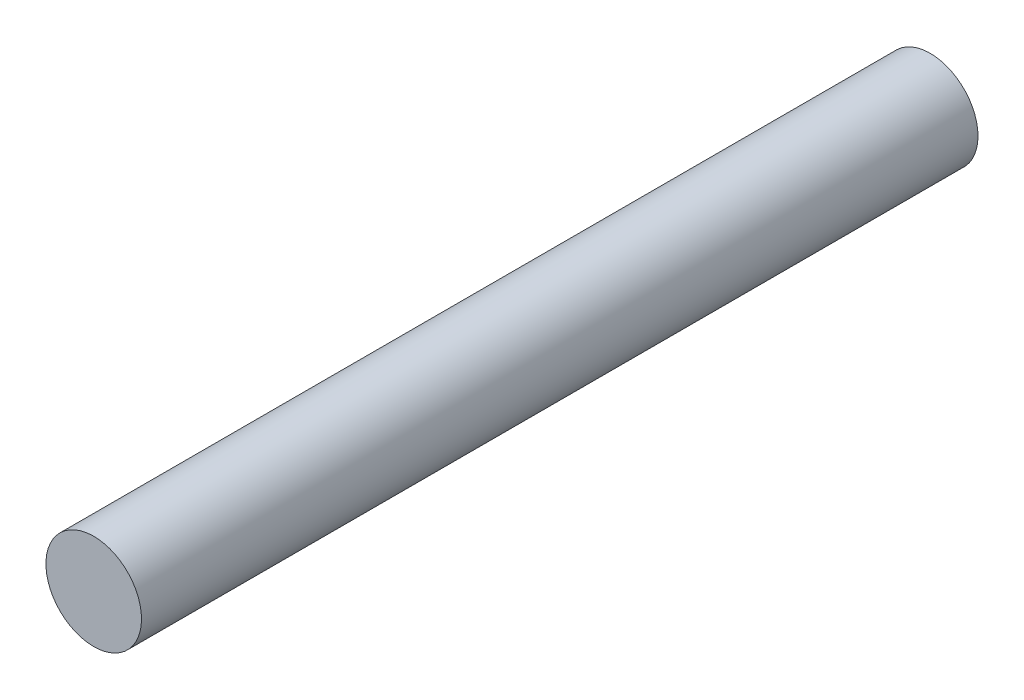
ISO-10303-21;
HEADER;
FILE_DESCRIPTION(('STEP AP214'),'2;1');
FILE_NAME('part.step','',(''),(''),'','','');
FILE_SCHEMA(('AUTOMOTIVE_DESIGN { 1 0 10303 214 1 1 1 1 }'));
ENDSEC;
DATA;
#1=APPLICATION_CONTEXT('core data for automotive mechanical design processes');
#2=APPLICATION_PROTOCOL_DEFINITION('international standard','automotive_design',2000,#1);
#3=PRODUCT_CONTEXT('',#1,'mechanical');
#4=PRODUCT('Part','Part','',(#3));
#5=PRODUCT_RELATED_PRODUCT_CATEGORY('part','',(#4));
#6=PRODUCT_DEFINITION_FORMATION('','',#4);
#7=PRODUCT_DEFINITION_CONTEXT('part definition',#1,'design');
#8=PRODUCT_DEFINITION('design','',#6,#7);
#9=PRODUCT_DEFINITION_SHAPE('','',#8);
#10=(LENGTH_UNIT() NAMED_UNIT(*) SI_UNIT(.MILLI.,.METRE.));
#11=(NAMED_UNIT(*) PLANE_ANGLE_UNIT() SI_UNIT($,.RADIAN.));
#12=(NAMED_UNIT(*) SI_UNIT($,.STERADIAN.) SOLID_ANGLE_UNIT());
#13=UNCERTAINTY_MEASURE_WITH_UNIT(LENGTH_MEASURE(1.E-05),#10,'distance_accuracy_value','');
#14=(GEOMETRIC_REPRESENTATION_CONTEXT(3) GLOBAL_UNCERTAINTY_ASSIGNED_CONTEXT((#13)) GLOBAL_UNIT_ASSIGNED_CONTEXT((#10,
#11,#12)) REPRESENTATION_CONTEXT('',''));
#15=CARTESIAN_POINT('',(0.,0.,0.));
#16=DIRECTION('',(0.,0.,1.));
#17=DIRECTION('',(1.,0.,0.));
#18=AXIS2_PLACEMENT_3D('',#15,#16,#17);
#19=CARTESIAN_POINT('',(0.,0.,70.));
#20=DIRECTION('',(0.,0.,-1.));
#21=DIRECTION('',(-1.,0.,0.));
#22=AXIS2_PLACEMENT_3D('',#19,#20,#21);
#23=CYLINDRICAL_SURFACE('',#22,4.);
#24=CARTESIAN_POINT('',(0.,0.,70.));
#25=DIRECTION('',(0.,0.,1.));
#26=DIRECTION('',(1.,0.,0.));
#27=AXIS2_PLACEMENT_3D('',#24,#25,#26);
#28=CIRCLE('',#27,4.);
#29=CARTESIAN_POINT('',(4.,0.,70.));
#30=VERTEX_POINT('',#29);
#31=EDGE_CURVE('E10',#30,#30,#28,.T.);
#32=ORIENTED_EDGE('',*,*,#31,.F.);
#33=EDGE_LOOP('',(#32));
#34=FACE_BOUND('',#33,.T.);
#35=CARTESIAN_POINT('',(0.,0.,0.));
#36=DIRECTION('',(0.,0.,1.));
#37=DIRECTION('',(1.,0.,0.));
#38=AXIS2_PLACEMENT_3D('',#35,#36,#37);
#39=CIRCLE('',#38,4.);
#40=CARTESIAN_POINT('',(4.,0.,0.));
#41=VERTEX_POINT('',#40);
#42=EDGE_CURVE('E35',#41,#41,#39,.T.);
#43=ORIENTED_EDGE('',*,*,#42,.T.);
#44=EDGE_LOOP('',(#43));
#45=FACE_BOUND('',#44,.T.);
#46=ADVANCED_FACE('F32',(#34,#45),#23,.T.);
#47=CARTESIAN_POINT('',(0.,0.,70.));
#48=DIRECTION('',(0.,0.,1.));
#49=DIRECTION('',(1.,0.,0.));
#50=AXIS2_PLACEMENT_3D('',#47,#48,#49);
#51=PLANE('',#50);
#52=ORIENTED_EDGE('',*,*,#31,.T.);
#53=EDGE_LOOP('',(#52));
#54=FACE_BOUND('',#53,.T.);
#55=ADVANCED_FACE('F47',(#54),#51,.T.);
#56=CARTESIAN_POINT('',(0.,0.,0.));
#57=DIRECTION('',(0.,0.,1.));
#58=DIRECTION('',(1.,0.,0.));
#59=AXIS2_PLACEMENT_3D('',#56,#57,#58);
#60=PLANE('',#59);
#61=ORIENTED_EDGE('',*,*,#42,.F.);
#62=EDGE_LOOP('',(#61));
#63=FACE_BOUND('',#62,.T.);
#64=ADVANCED_FACE('F45',(#63),#60,.F.);
#65=CLOSED_SHELL('',(#46,#55,#64));
#66=MANIFOLD_SOLID_BREP('B2',#65);
#67=ADVANCED_BREP_SHAPE_REPRESENTATION('',(#18,#66),#14);
#68=SHAPE_DEFINITION_REPRESENTATION(#9,#67);
ENDSEC;
END-ISO-10303-21;
